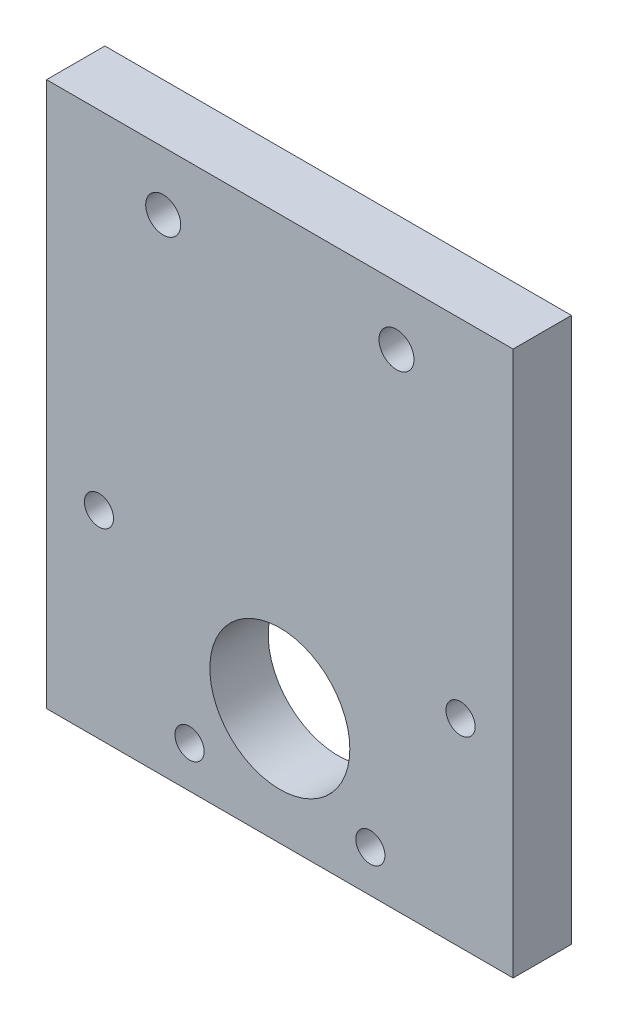
ISO-10303-21;
HEADER;
FILE_DESCRIPTION(('STEP AP214'),'2;1');
FILE_NAME('part.step','',(''),(''),'','','');
FILE_SCHEMA(('AUTOMOTIVE_DESIGN { 1 0 10303 214 1 1 1 1 }'));
ENDSEC;
DATA;
#1=APPLICATION_CONTEXT('core data for automotive mechanical design processes');
#2=APPLICATION_PROTOCOL_DEFINITION('international standard','automotive_design',2000,#1);
#3=PRODUCT_CONTEXT('',#1,'mechanical');
#4=PRODUCT('Part','Part','',(#3));
#5=PRODUCT_RELATED_PRODUCT_CATEGORY('part','',(#4));
#6=PRODUCT_DEFINITION_FORMATION('','',#4);
#7=PRODUCT_DEFINITION_CONTEXT('part definition',#1,'design');
#8=PRODUCT_DEFINITION('design','',#6,#7);
#9=PRODUCT_DEFINITION_SHAPE('','',#8);
#10=(LENGTH_UNIT() NAMED_UNIT(*) SI_UNIT(.MILLI.,.METRE.));
#11=(NAMED_UNIT(*) PLANE_ANGLE_UNIT() SI_UNIT($,.RADIAN.));
#12=(NAMED_UNIT(*) SI_UNIT($,.STERADIAN.) SOLID_ANGLE_UNIT());
#13=UNCERTAINTY_MEASURE_WITH_UNIT(LENGTH_MEASURE(1.E-05),#10,'distance_accuracy_value','');
#14=(GEOMETRIC_REPRESENTATION_CONTEXT(3) GLOBAL_UNCERTAINTY_ASSIGNED_CONTEXT((#13)) GLOBAL_UNIT_ASSIGNED_CONTEXT((#10,
#11,#12)) REPRESENTATION_CONTEXT('',''));
#15=CARTESIAN_POINT('',(0.,0.,0.));
#16=DIRECTION('',(0.,0.,1.));
#17=DIRECTION('',(1.,0.,0.));
#18=AXIS2_PLACEMENT_3D('',#15,#16,#17);
#19=CARTESIAN_POINT('',(0.,0.,5.));
#20=DIRECTION('',(0.,0.,-1.));
#21=DIRECTION('',(-1.,0.,0.));
#22=AXIS2_PLACEMENT_3D('',#19,#20,#21);
#23=PLANE('',#22);
#24=DIRECTION('',(0.,-1.,0.));
#25=VECTOR('',#24,1.);
#26=CARTESIAN_POINT('',(0.,-2.85714285714285,5.));
#27=LINE('',#26,#25);
#28=CARTESIAN_POINT('',(0.,43.8408888119213,5.));
#29=VERTEX_POINT('',#28);
#30=CARTESIAN_POINT('',(0.,-2.85714285714285,5.));
#31=VERTEX_POINT('',#30);
#32=EDGE_CURVE('E50',#29,#31,#27,.T.);
#33=ORIENTED_EDGE('',*,*,#32,.T.);
#34=DIRECTION('',(1.,0.,0.));
#35=VECTOR('',#34,1.);
#36=CARTESIAN_POINT('',(0.,-2.85714285714285,5.));
#37=LINE('',#36,#35);
#38=CARTESIAN_POINT('',(40.,-2.85714285714285,5.));
#39=VERTEX_POINT('',#38);
#40=EDGE_CURVE('E80',#31,#39,#37,.T.);
#41=ORIENTED_EDGE('',*,*,#40,.T.);
#42=DIRECTION('',(0.,1.,0.));
#43=VECTOR('',#42,1.);
#44=CARTESIAN_POINT('',(40.,-2.85714285714285,5.));
#45=LINE('',#44,#43);
#46=CARTESIAN_POINT('',(40.,43.8408888119213,5.));
#47=VERTEX_POINT('',#46);
#48=EDGE_CURVE('E84',#39,#47,#45,.T.);
#49=ORIENTED_EDGE('',*,*,#48,.T.);
#50=DIRECTION('',(-1.,0.,0.));
#51=VECTOR('',#50,1.);
#52=CARTESIAN_POINT('',(0.,43.8408888119213,5.));
#53=LINE('',#52,#51);
#54=EDGE_CURVE('E92',#47,#29,#53,.T.);
#55=ORIENTED_EDGE('',*,*,#54,.T.);
#56=EDGE_LOOP('',(#33,#41,#49,#55));
#57=FACE_BOUND('',#56,.T.);
#58=CARTESIAN_POINT('',(20.,7.14285714285715,5.));
#59=DIRECTION('',(0.,0.,1.));
#60=DIRECTION('',(1.,0.,0.));
#61=AXIS2_PLACEMENT_3D('',#58,#59,#60);
#62=CIRCLE('',#61,6.);
#63=CARTESIAN_POINT('',(26.,7.14285714285715,5.));
#64=VERTEX_POINT('',#63);
#65=EDGE_CURVE('E99',#64,#64,#62,.T.);
#66=ORIENTED_EDGE('',*,*,#65,.F.);
#67=EDGE_LOOP('',(#66));
#68=FACE_BOUND('',#67,.T.);
#69=CARTESIAN_POINT('',(4.49148360782059,14.1239687530172,5.));
#70=DIRECTION('',(0.,0.,1.));
#71=DIRECTION('',(1.,0.,0.));
#72=AXIS2_PLACEMENT_3D('',#69,#70,#71);
#73=CIRCLE('',#72,1.24999999999999);
#74=CARTESIAN_POINT('',(5.74148360782058,14.1239687530172,5.));
#75=VERTEX_POINT('',#74);
#76=EDGE_CURVE('E190',#75,#75,#73,.T.);
#77=ORIENTED_EDGE('',*,*,#76,.F.);
#78=EDGE_LOOP('',(#77));
#79=FACE_BOUND('',#78,.T.);
#80=CARTESIAN_POINT('',(12.2578311833527,0.710026553349733,5.));
#81=DIRECTION('',(0.,0.,1.));
#82=DIRECTION('',(1.,0.,0.));
#83=AXIS2_PLACEMENT_3D('',#80,#81,#82);
#84=CIRCLE('',#83,1.24999999999999);
#85=CARTESIAN_POINT('',(13.5078311833527,0.710026553349733,5.));
#86=VERTEX_POINT('',#85);
#87=EDGE_CURVE('E184',#86,#86,#84,.T.);
#88=ORIENTED_EDGE('',*,*,#87,.F.);
#89=EDGE_LOOP('',(#88));
#90=FACE_BOUND('',#89,.T.);
#91=CARTESIAN_POINT('',(27.7578196809272,0.728909748546428,5.));
#92=DIRECTION('',(0.,0.,1.));
#93=DIRECTION('',(1.,0.,0.));
#94=AXIS2_PLACEMENT_3D('',#91,#92,#93);
#95=CIRCLE('',#94,1.24999999999999);
#96=CARTESIAN_POINT('',(29.0078196809272,0.728909748546428,5.));
#97=VERTEX_POINT('',#96);
#98=EDGE_CURVE('E178',#97,#97,#95,.T.);
#99=ORIENTED_EDGE('',*,*,#98,.F.);
#100=EDGE_LOOP('',(#99));
#101=FACE_BOUND('',#100,.T.);
#102=CARTESIAN_POINT('',(35.4914606029694,14.1617351434108,5.));
#103=DIRECTION('',(0.,0.,1.));
#104=DIRECTION('',(1.,0.,0.));
#105=AXIS2_PLACEMENT_3D('',#102,#103,#104);
#106=CIRCLE('',#105,1.25);
#107=CARTESIAN_POINT('',(36.7414606029694,14.1617351434108,5.));
#108=VERTEX_POINT('',#107);
#109=EDGE_CURVE('E172',#108,#108,#106,.T.);
#110=ORIENTED_EDGE('',*,*,#109,.F.);
#111=EDGE_LOOP('',(#110));
#112=FACE_BOUND('',#111,.T.);
#113=CARTESIAN_POINT('',(10.,38.8074110582364,5.));
#114=DIRECTION('',(0.,0.,1.));
#115=DIRECTION('',(1.,0.,0.));
#116=AXIS2_PLACEMENT_3D('',#113,#114,#115);
#117=CIRCLE('',#116,1.5);
#118=CARTESIAN_POINT('',(11.5,38.8074110582364,5.));
#119=VERTEX_POINT('',#118);
#120=EDGE_CURVE('E166',#119,#119,#117,.T.);
#121=ORIENTED_EDGE('',*,*,#120,.F.);
#122=EDGE_LOOP('',(#121));
#123=FACE_BOUND('',#122,.T.);
#124=CARTESIAN_POINT('',(30.,38.8074110582364,5.));
#125=DIRECTION('',(0.,0.,1.));
#126=DIRECTION('',(-1.,0.,0.));
#127=AXIS2_PLACEMENT_3D('',#124,#125,#126);
#128=CIRCLE('',#127,1.5);
#129=CARTESIAN_POINT('',(28.5,38.8074110582364,5.));
#130=VERTEX_POINT('',#129);
#131=EDGE_CURVE('E157',#130,#130,#128,.T.);
#132=ORIENTED_EDGE('',*,*,#131,.F.);
#133=EDGE_LOOP('',(#132));
#134=FACE_BOUND('',#133,.T.);
#135=ADVANCED_FACE('F33',(#57,#68,#79,#90,#101,#112,#123,#134),#23,.F.);
#136=CARTESIAN_POINT('',(0.,0.,0.));
#137=DIRECTION('',(0.,0.,-1.));
#138=DIRECTION('',(-1.,0.,0.));
#139=AXIS2_PLACEMENT_3D('',#136,#137,#138);
#140=PLANE('',#139);
#141=CARTESIAN_POINT('',(10.,38.8074110582364,0.));
#142=DIRECTION('',(0.,0.,1.));
#143=DIRECTION('',(1.,0.,0.));
#144=AXIS2_PLACEMENT_3D('',#141,#142,#143);
#145=CIRCLE('',#144,1.5);
#146=CARTESIAN_POINT('',(11.5,38.8074110582364,0.));
#147=VERTEX_POINT('',#146);
#148=EDGE_CURVE('E163',#147,#147,#145,.T.);
#149=ORIENTED_EDGE('',*,*,#148,.T.);
#150=EDGE_LOOP('',(#149));
#151=FACE_BOUND('',#150,.T.);
#152=CARTESIAN_POINT('',(27.7578196809272,0.728909748546428,0.));
#153=DIRECTION('',(0.,0.,1.));
#154=DIRECTION('',(1.,0.,0.));
#155=AXIS2_PLACEMENT_3D('',#152,#153,#154);
#156=CIRCLE('',#155,1.24999999999999);
#157=CARTESIAN_POINT('',(29.0078196809272,0.728909748546428,0.));
#158=VERTEX_POINT('',#157);
#159=EDGE_CURVE('E175',#158,#158,#156,.T.);
#160=ORIENTED_EDGE('',*,*,#159,.T.);
#161=EDGE_LOOP('',(#160));
#162=FACE_BOUND('',#161,.T.);
#163=CARTESIAN_POINT('',(4.49148360782059,14.1239687530172,0.));
#164=DIRECTION('',(0.,0.,1.));
#165=DIRECTION('',(1.,0.,0.));
#166=AXIS2_PLACEMENT_3D('',#163,#164,#165);
#167=CIRCLE('',#166,1.24999999999999);
#168=CARTESIAN_POINT('',(5.74148360782058,14.1239687530172,0.));
#169=VERTEX_POINT('',#168);
#170=EDGE_CURVE('E187',#169,#169,#167,.T.);
#171=ORIENTED_EDGE('',*,*,#170,.T.);
#172=EDGE_LOOP('',(#171));
#173=FACE_BOUND('',#172,.T.);
#174=DIRECTION('',(1.,0.,0.));
#175=VECTOR('',#174,1.);
#176=CARTESIAN_POINT('',(0.,-2.85714285714285,0.));
#177=LINE('',#176,#175);
#178=CARTESIAN_POINT('',(0.,-2.85714285714285,0.));
#179=VERTEX_POINT('',#178);
#180=CARTESIAN_POINT('',(40.,-2.85714285714285,0.));
#181=VERTEX_POINT('',#180);
#182=EDGE_CURVE('E88',#179,#181,#177,.T.);
#183=ORIENTED_EDGE('',*,*,#182,.F.);
#184=DIRECTION('',(0.,-1.,0.));
#185=VECTOR('',#184,1.);
#186=CARTESIAN_POINT('',(0.,37.1428571428571,0.));
#187=LINE('',#186,#185);
#188=CARTESIAN_POINT('',(0.,43.8408888119213,0.));
#189=VERTEX_POINT('',#188);
#190=EDGE_CURVE('E102',#189,#179,#187,.T.);
#191=ORIENTED_EDGE('',*,*,#190,.F.);
#192=DIRECTION('',(-1.,0.,0.));
#193=VECTOR('',#192,1.);
#194=CARTESIAN_POINT('',(0.,43.8408888119213,0.));
#195=LINE('',#194,#193);
#196=CARTESIAN_POINT('',(40.,43.8408888119213,0.));
#197=VERTEX_POINT('',#196);
#198=EDGE_CURVE('E74',#197,#189,#195,.T.);
#199=ORIENTED_EDGE('',*,*,#198,.F.);
#200=DIRECTION('',(0.,1.,0.));
#201=VECTOR('',#200,1.);
#202=CARTESIAN_POINT('',(40.,37.1428571428571,0.));
#203=LINE('',#202,#201);
#204=EDGE_CURVE('E67',#181,#197,#203,.T.);
#205=ORIENTED_EDGE('',*,*,#204,.F.);
#206=EDGE_LOOP('',(#183,#191,#199,#205));
#207=FACE_BOUND('',#206,.T.);
#208=CARTESIAN_POINT('',(20.,7.14285714285715,0.));
#209=DIRECTION('',(0.,0.,1.));
#210=DIRECTION('',(1.,0.,0.));
#211=AXIS2_PLACEMENT_3D('',#208,#209,#210);
#212=CIRCLE('',#211,6.);
#213=CARTESIAN_POINT('',(26.,7.14285714285715,0.));
#214=VERTEX_POINT('',#213);
#215=EDGE_CURVE('E193',#214,#214,#212,.T.);
#216=ORIENTED_EDGE('',*,*,#215,.T.);
#217=EDGE_LOOP('',(#216));
#218=FACE_BOUND('',#217,.T.);
#219=CARTESIAN_POINT('',(12.2578311833527,0.710026553349733,0.));
#220=DIRECTION('',(0.,0.,1.));
#221=DIRECTION('',(1.,0.,0.));
#222=AXIS2_PLACEMENT_3D('',#219,#220,#221);
#223=CIRCLE('',#222,1.24999999999999);
#224=CARTESIAN_POINT('',(13.5078311833527,0.710026553349733,0.));
#225=VERTEX_POINT('',#224);
#226=EDGE_CURVE('E181',#225,#225,#223,.T.);
#227=ORIENTED_EDGE('',*,*,#226,.T.);
#228=EDGE_LOOP('',(#227));
#229=FACE_BOUND('',#228,.T.);
#230=CARTESIAN_POINT('',(35.4914606029694,14.1617351434108,0.));
#231=DIRECTION('',(0.,0.,1.));
#232=DIRECTION('',(1.,0.,0.));
#233=AXIS2_PLACEMENT_3D('',#230,#231,#232);
#234=CIRCLE('',#233,1.25);
#235=CARTESIAN_POINT('',(36.7414606029694,14.1617351434108,0.));
#236=VERTEX_POINT('',#235);
#237=EDGE_CURVE('E169',#236,#236,#234,.T.);
#238=ORIENTED_EDGE('',*,*,#237,.T.);
#239=EDGE_LOOP('',(#238));
#240=FACE_BOUND('',#239,.T.);
#241=CARTESIAN_POINT('',(30.,38.8074110582364,0.));
#242=DIRECTION('',(0.,0.,1.));
#243=DIRECTION('',(-1.,0.,0.));
#244=AXIS2_PLACEMENT_3D('',#241,#242,#243);
#245=CIRCLE('',#244,1.5);
#246=CARTESIAN_POINT('',(28.5,38.8074110582364,0.));
#247=VERTEX_POINT('',#246);
#248=EDGE_CURVE('E160',#247,#247,#245,.T.);
#249=ORIENTED_EDGE('',*,*,#248,.T.);
#250=EDGE_LOOP('',(#249));
#251=FACE_BOUND('',#250,.T.);
#252=ADVANCED_FACE('F108',(#151,#162,#173,#207,#218,#229,#240,#251),#140,.T.);
#253=CARTESIAN_POINT('',(0.,-2.85714285714285,5.));
#254=DIRECTION('',(0.,1.,0.));
#255=DIRECTION('',(0.,0.,1.));
#256=AXIS2_PLACEMENT_3D('',#253,#254,#255);
#257=PLANE('',#256);
#258=ORIENTED_EDGE('',*,*,#182,.T.);
#259=DIRECTION('',(0.,0.,-1.));
#260=VECTOR('',#259,1.);
#261=CARTESIAN_POINT('',(40.,-2.85714285714285,5.));
#262=LINE('',#261,#260);
#263=EDGE_CURVE('E42',#39,#181,#262,.T.);
#264=ORIENTED_EDGE('',*,*,#263,.F.);
#265=ORIENTED_EDGE('',*,*,#40,.F.);
#266=DIRECTION('',(0.,0.,-1.));
#267=VECTOR('',#266,1.);
#268=CARTESIAN_POINT('',(0.,-2.85714285714285,5.));
#269=LINE('',#268,#267);
#270=EDGE_CURVE('E11',#31,#179,#269,.T.);
#271=ORIENTED_EDGE('',*,*,#270,.T.);
#272=EDGE_LOOP('',(#258,#264,#265,#271));
#273=FACE_BOUND('',#272,.T.);
#274=ADVANCED_FACE('F35',(#273),#257,.F.);
#275=CARTESIAN_POINT('',(40.,37.1428571428571,5.));
#276=DIRECTION('',(-1.,0.,0.));
#277=DIRECTION('',(0.,0.,1.));
#278=AXIS2_PLACEMENT_3D('',#275,#276,#277);
#279=PLANE('',#278);
#280=ORIENTED_EDGE('',*,*,#204,.T.);
#281=DIRECTION('',(0.,0.,-1.));
#282=VECTOR('',#281,1.);
#283=CARTESIAN_POINT('',(40.,43.8408888119213,5.));
#284=LINE('',#283,#282);
#285=EDGE_CURVE('E89',#47,#197,#284,.T.);
#286=ORIENTED_EDGE('',*,*,#285,.F.);
#287=ORIENTED_EDGE('',*,*,#48,.F.);
#288=ORIENTED_EDGE('',*,*,#263,.T.);
#289=EDGE_LOOP('',(#280,#286,#287,#288));
#290=FACE_BOUND('',#289,.T.);
#291=ADVANCED_FACE('F90',(#290),#279,.F.);
#292=CARTESIAN_POINT('',(0.,43.8408888119213,5.));
#293=DIRECTION('',(0.,-1.,0.));
#294=DIRECTION('',(0.,0.,-1.));
#295=AXIS2_PLACEMENT_3D('',#292,#293,#294);
#296=PLANE('',#295);
#297=ORIENTED_EDGE('',*,*,#198,.T.);
#298=DIRECTION('',(0.,0.,-1.));
#299=VECTOR('',#298,1.);
#300=CARTESIAN_POINT('',(0.,43.8408888119213,5.));
#301=LINE('',#300,#299);
#302=EDGE_CURVE('E94',#29,#189,#301,.T.);
#303=ORIENTED_EDGE('',*,*,#302,.F.);
#304=ORIENTED_EDGE('',*,*,#54,.F.);
#305=ORIENTED_EDGE('',*,*,#285,.T.);
#306=EDGE_LOOP('',(#297,#303,#304,#305));
#307=FACE_BOUND('',#306,.T.);
#308=ADVANCED_FACE('F105',(#307),#296,.F.);
#309=CARTESIAN_POINT('',(0.,37.1428571428571,5.));
#310=DIRECTION('',(1.,0.,0.));
#311=DIRECTION('',(0.,0.,-1.));
#312=AXIS2_PLACEMENT_3D('',#309,#310,#311);
#313=PLANE('',#312);
#314=ORIENTED_EDGE('',*,*,#190,.T.);
#315=ORIENTED_EDGE('',*,*,#270,.F.);
#316=ORIENTED_EDGE('',*,*,#32,.F.);
#317=ORIENTED_EDGE('',*,*,#302,.T.);
#318=EDGE_LOOP('',(#314,#315,#316,#317));
#319=FACE_BOUND('',#318,.T.);
#320=ADVANCED_FACE('F110',(#319),#313,.F.);
#321=CARTESIAN_POINT('',(20.,7.14285714285715,5.));
#322=DIRECTION('',(0.,0.,-1.));
#323=DIRECTION('',(-1.,0.,0.));
#324=AXIS2_PLACEMENT_3D('',#321,#322,#323);
#325=CYLINDRICAL_SURFACE('',#324,6.);
#326=ORIENTED_EDGE('',*,*,#65,.T.);
#327=EDGE_LOOP('',(#326));
#328=FACE_BOUND('',#327,.T.);
#329=ORIENTED_EDGE('',*,*,#215,.F.);
#330=EDGE_LOOP('',(#329));
#331=FACE_BOUND('',#330,.T.);
#332=ADVANCED_FACE('F112',(#328,#331),#325,.F.);
#333=CARTESIAN_POINT('',(4.49148360782059,14.1239687530172,5.));
#334=DIRECTION('',(0.,0.,-1.));
#335=DIRECTION('',(-1.,0.,0.));
#336=AXIS2_PLACEMENT_3D('',#333,#334,#335);
#337=CYLINDRICAL_SURFACE('',#336,1.24999999999999);
#338=ORIENTED_EDGE('',*,*,#76,.T.);
#339=EDGE_LOOP('',(#338));
#340=FACE_BOUND('',#339,.T.);
#341=ORIENTED_EDGE('',*,*,#170,.F.);
#342=EDGE_LOOP('',(#341));
#343=FACE_BOUND('',#342,.T.);
#344=ADVANCED_FACE('F118',(#340,#343),#337,.F.);
#345=CARTESIAN_POINT('',(12.2578311833527,0.710026553349733,5.));
#346=DIRECTION('',(0.,0.,-1.));
#347=DIRECTION('',(-1.,0.,0.));
#348=AXIS2_PLACEMENT_3D('',#345,#346,#347);
#349=CYLINDRICAL_SURFACE('',#348,1.24999999999999);
#350=ORIENTED_EDGE('',*,*,#87,.T.);
#351=EDGE_LOOP('',(#350));
#352=FACE_BOUND('',#351,.T.);
#353=ORIENTED_EDGE('',*,*,#226,.F.);
#354=EDGE_LOOP('',(#353));
#355=FACE_BOUND('',#354,.T.);
#356=ADVANCED_FACE('F132',(#352,#355),#349,.F.);
#357=CARTESIAN_POINT('',(27.7578196809272,0.728909748546428,5.));
#358=DIRECTION('',(0.,0.,-1.));
#359=DIRECTION('',(-1.,0.,0.));
#360=AXIS2_PLACEMENT_3D('',#357,#358,#359);
#361=CYLINDRICAL_SURFACE('',#360,1.24999999999999);
#362=ORIENTED_EDGE('',*,*,#98,.T.);
#363=EDGE_LOOP('',(#362));
#364=FACE_BOUND('',#363,.T.);
#365=ORIENTED_EDGE('',*,*,#159,.F.);
#366=EDGE_LOOP('',(#365));
#367=FACE_BOUND('',#366,.T.);
#368=ADVANCED_FACE('F136',(#364,#367),#361,.F.);
#369=CARTESIAN_POINT('',(35.4914606029694,14.1617351434108,5.));
#370=DIRECTION('',(0.,0.,-1.));
#371=DIRECTION('',(-1.,0.,0.));
#372=AXIS2_PLACEMENT_3D('',#369,#370,#371);
#373=CYLINDRICAL_SURFACE('',#372,1.25);
#374=ORIENTED_EDGE('',*,*,#109,.T.);
#375=EDGE_LOOP('',(#374));
#376=FACE_BOUND('',#375,.T.);
#377=ORIENTED_EDGE('',*,*,#237,.F.);
#378=EDGE_LOOP('',(#377));
#379=FACE_BOUND('',#378,.T.);
#380=ADVANCED_FACE('F140',(#376,#379),#373,.F.);
#381=CARTESIAN_POINT('',(10.,38.8074110582364,5.));
#382=DIRECTION('',(0.,0.,-1.));
#383=DIRECTION('',(-1.,0.,0.));
#384=AXIS2_PLACEMENT_3D('',#381,#382,#383);
#385=CYLINDRICAL_SURFACE('',#384,1.5);
#386=ORIENTED_EDGE('',*,*,#120,.T.);
#387=EDGE_LOOP('',(#386));
#388=FACE_BOUND('',#387,.T.);
#389=ORIENTED_EDGE('',*,*,#148,.F.);
#390=EDGE_LOOP('',(#389));
#391=FACE_BOUND('',#390,.T.);
#392=ADVANCED_FACE('F144',(#388,#391),#385,.F.);
#393=CARTESIAN_POINT('',(30.,38.8074110582364,5.));
#394=DIRECTION('',(0.,0.,-1.));
#395=DIRECTION('',(-1.,0.,0.));
#396=AXIS2_PLACEMENT_3D('',#393,#394,#395);
#397=CYLINDRICAL_SURFACE('',#396,1.5);
#398=ORIENTED_EDGE('',*,*,#131,.T.);
#399=EDGE_LOOP('',(#398));
#400=FACE_BOUND('',#399,.T.);
#401=ORIENTED_EDGE('',*,*,#248,.F.);
#402=EDGE_LOOP('',(#401));
#403=FACE_BOUND('',#402,.T.);
#404=ADVANCED_FACE('F148',(#400,#403),#397,.F.);
#405=CLOSED_SHELL('',(#135,#252,#274,#291,#308,#320,#332,#344,#356,#368,#380,#392,#404));
#406=MANIFOLD_SOLID_BREP('B2',#405);
#407=ADVANCED_BREP_SHAPE_REPRESENTATION('',(#18,#406),#14);
#408=SHAPE_DEFINITION_REPRESENTATION(#9,#407);
ENDSEC;
END-ISO-10303-21;
